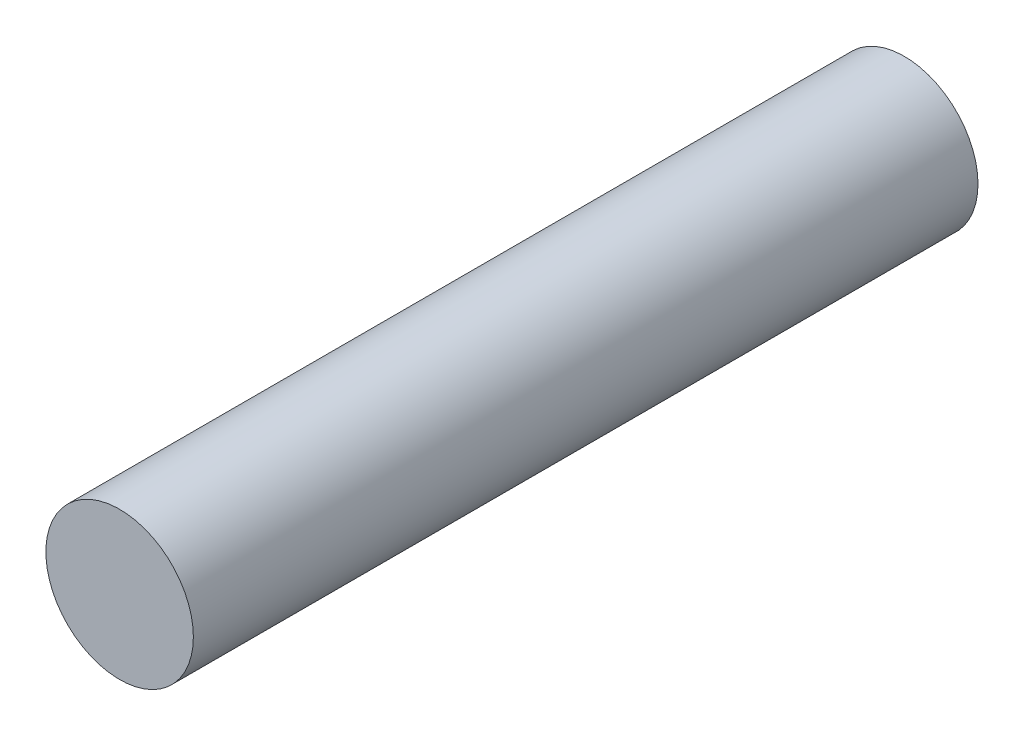
ISO-10303-21;
HEADER;
FILE_DESCRIPTION(('STEP AP214'),'2;1');
FILE_NAME('part.step','',(''),(''),'','','');
FILE_SCHEMA(('AUTOMOTIVE_DESIGN { 1 0 10303 214 1 1 1 1 }'));
ENDSEC;
DATA;
#1=APPLICATION_CONTEXT('core data for automotive mechanical design processes');
#2=APPLICATION_PROTOCOL_DEFINITION('international standard','automotive_design',2000,#1);
#3=PRODUCT_CONTEXT('',#1,'mechanical');
#4=PRODUCT('Part','Part','',(#3));
#5=PRODUCT_RELATED_PRODUCT_CATEGORY('part','',(#4));
#6=PRODUCT_DEFINITION_FORMATION('','',#4);
#7=PRODUCT_DEFINITION_CONTEXT('part definition',#1,'design');
#8=PRODUCT_DEFINITION('design','',#6,#7);
#9=PRODUCT_DEFINITION_SHAPE('','',#8);
#10=(LENGTH_UNIT() NAMED_UNIT(*) SI_UNIT(.MILLI.,.METRE.));
#11=(NAMED_UNIT(*) PLANE_ANGLE_UNIT() SI_UNIT($,.RADIAN.));
#12=(NAMED_UNIT(*) SI_UNIT($,.STERADIAN.) SOLID_ANGLE_UNIT());
#13=UNCERTAINTY_MEASURE_WITH_UNIT(LENGTH_MEASURE(1.E-05),#10,'distance_accuracy_value','');
#14=(GEOMETRIC_REPRESENTATION_CONTEXT(3) GLOBAL_UNCERTAINTY_ASSIGNED_CONTEXT((#13)) GLOBAL_UNIT_ASSIGNED_CONTEXT((#10,
#11,#12)) REPRESENTATION_CONTEXT('',''));
#15=CARTESIAN_POINT('',(0.,0.,0.));
#16=DIRECTION('',(0.,0.,1.));
#17=DIRECTION('',(1.,0.,0.));
#18=AXIS2_PLACEMENT_3D('',#15,#16,#17);
#19=CARTESIAN_POINT('',(-3.48161600558883,1.20641600945066,25.));
#20=DIRECTION('',(0.,0.,-1.));
#21=DIRECTION('',(-1.,0.,0.));
#22=AXIS2_PLACEMENT_3D('',#19,#20,#21);
#23=CYLINDRICAL_SURFACE('',#22,2.35);
#24=CARTESIAN_POINT('',(-3.48161600558883,1.20641600945066,25.));
#25=DIRECTION('',(0.,0.,1.));
#26=DIRECTION('',(1.,0.,0.));
#27=AXIS2_PLACEMENT_3D('',#24,#25,#26);
#28=CIRCLE('',#27,2.35);
#29=CARTESIAN_POINT('',(-1.13161600558883,1.20641600945066,25.));
#30=VERTEX_POINT('',#29);
#31=EDGE_CURVE('E10',#30,#30,#28,.T.);
#32=ORIENTED_EDGE('',*,*,#31,.F.);
#33=EDGE_LOOP('',(#32));
#34=FACE_BOUND('',#33,.T.);
#35=CARTESIAN_POINT('',(-3.48161600558883,1.20641600945066,0.));
#36=DIRECTION('',(0.,0.,1.));
#37=DIRECTION('',(1.,0.,0.));
#38=AXIS2_PLACEMENT_3D('',#35,#36,#37);
#39=CIRCLE('',#38,2.35);
#40=CARTESIAN_POINT('',(-1.13161600558883,1.20641600945066,0.));
#41=VERTEX_POINT('',#40);
#42=EDGE_CURVE('E40',#41,#41,#39,.T.);
#43=ORIENTED_EDGE('',*,*,#42,.T.);
#44=EDGE_LOOP('',(#43));
#45=FACE_BOUND('',#44,.T.);
#46=ADVANCED_FACE('F37',(#34,#45),#23,.T.);
#47=CARTESIAN_POINT('',(-3.48161600558883,1.20641600945066,25.));
#48=DIRECTION('',(0.,0.,1.));
#49=DIRECTION('',(1.,0.,0.));
#50=AXIS2_PLACEMENT_3D('',#47,#48,#49);
#51=PLANE('',#50);
#52=ORIENTED_EDGE('',*,*,#31,.T.);
#53=EDGE_LOOP('',(#52));
#54=FACE_BOUND('',#53,.T.);
#55=ADVANCED_FACE('F54',(#54),#51,.T.);
#56=CARTESIAN_POINT('',(-3.48161600558883,1.20641600945066,0.));
#57=DIRECTION('',(0.,0.,1.));
#58=DIRECTION('',(1.,0.,0.));
#59=AXIS2_PLACEMENT_3D('',#56,#57,#58);
#60=PLANE('',#59);
#61=ORIENTED_EDGE('',*,*,#42,.F.);
#62=EDGE_LOOP('',(#61));
#63=FACE_BOUND('',#62,.T.);
#64=ADVANCED_FACE('F52',(#63),#60,.F.);
#65=CLOSED_SHELL('',(#46,#55,#64));
#66=MANIFOLD_SOLID_BREP('B2',#65);
#67=ADVANCED_BREP_SHAPE_REPRESENTATION('',(#18,#66),#14);
#68=SHAPE_DEFINITION_REPRESENTATION(#9,#67);
ENDSEC;
END-ISO-10303-21;
